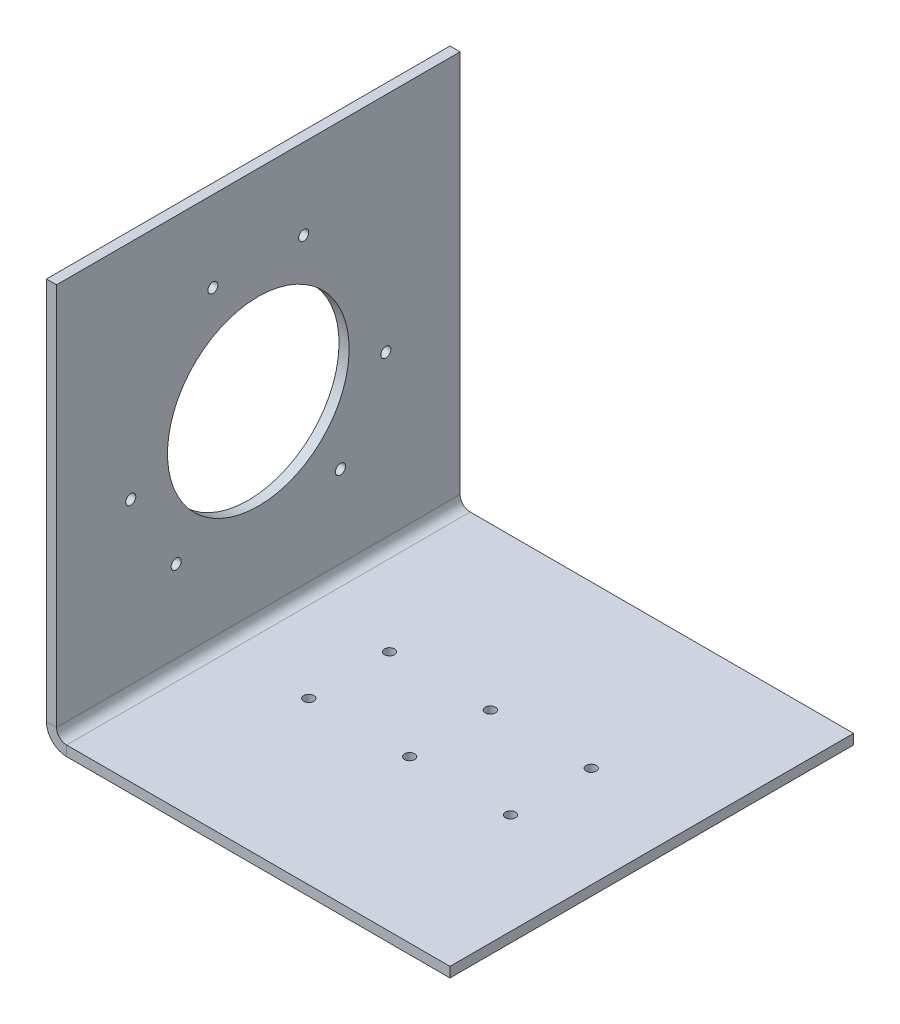
ISO-10303-21;
HEADER;
FILE_DESCRIPTION(('STEP AP214'),'2;1');
FILE_NAME('part.step','',(''),(''),'','','');
FILE_SCHEMA(('AUTOMOTIVE_DESIGN { 1 0 10303 214 1 1 1 1 }'));
ENDSEC;
DATA;
#1=APPLICATION_CONTEXT('core data for automotive mechanical design processes');
#2=APPLICATION_PROTOCOL_DEFINITION('international standard','automotive_design',2000,#1);
#3=PRODUCT_CONTEXT('',#1,'mechanical');
#4=PRODUCT('Part','Part','',(#3));
#5=PRODUCT_RELATED_PRODUCT_CATEGORY('part','',(#4));
#6=PRODUCT_DEFINITION_FORMATION('','',#4);
#7=PRODUCT_DEFINITION_CONTEXT('part definition',#1,'design');
#8=PRODUCT_DEFINITION('design','',#6,#7);
#9=PRODUCT_DEFINITION_SHAPE('','',#8);
#10=(LENGTH_UNIT() NAMED_UNIT(*) SI_UNIT(.MILLI.,.METRE.));
#11=(NAMED_UNIT(*) PLANE_ANGLE_UNIT() SI_UNIT($,.RADIAN.));
#12=(NAMED_UNIT(*) SI_UNIT($,.STERADIAN.) SOLID_ANGLE_UNIT());
#13=UNCERTAINTY_MEASURE_WITH_UNIT(LENGTH_MEASURE(1.E-05),#10,'distance_accuracy_value','');
#14=(GEOMETRIC_REPRESENTATION_CONTEXT(3) GLOBAL_UNCERTAINTY_ASSIGNED_CONTEXT((#13)) GLOBAL_UNIT_ASSIGNED_CONTEXT((#10,
#11,#12)) REPRESENTATION_CONTEXT('',''));
#15=CARTESIAN_POINT('',(0.,0.,0.));
#16=DIRECTION('',(0.,0.,1.));
#17=DIRECTION('',(1.,0.,0.));
#18=AXIS2_PLACEMENT_3D('',#15,#16,#17);
#19=CARTESIAN_POINT('',(0.,-6.35,0.));
#20=DIRECTION('',(0.,0.,1.));
#21=DIRECTION('',(1.,0.,0.));
#22=AXIS2_PLACEMENT_3D('',#19,#20,#21);
#23=PLANE('',#22);
#24=DIRECTION('',(1.,0.,0.));
#25=VECTOR('',#24,1.);
#26=CARTESIAN_POINT('',(0.,0.,0.));
#27=LINE('',#26,#25);
#28=CARTESIAN_POINT('',(12.7,0.,0.));
#29=VERTEX_POINT('',#28);
#30=CARTESIAN_POINT('',(254.,0.,0.));
#31=VERTEX_POINT('',#30);
#32=EDGE_CURVE('E108',#29,#31,#27,.T.);
#33=ORIENTED_EDGE('',*,*,#32,.F.);
#34=DIRECTION('',(0.,-1.,0.));
#35=VECTOR('',#34,1.);
#36=CARTESIAN_POINT('',(12.7,0.,0.));
#37=LINE('',#36,#35);
#38=CARTESIAN_POINT('',(12.7,-6.34999999999998,0.));
#39=VERTEX_POINT('',#38);
#40=EDGE_CURVE('E160',#29,#39,#37,.T.);
#41=ORIENTED_EDGE('',*,*,#40,.T.);
#42=DIRECTION('',(1.,0.,0.));
#43=VECTOR('',#42,1.);
#44=CARTESIAN_POINT('',(0.,-6.35,0.));
#45=LINE('',#44,#43);
#46=CARTESIAN_POINT('',(254.,-6.35,0.));
#47=VERTEX_POINT('',#46);
#48=EDGE_CURVE('E113',#39,#47,#45,.T.);
#49=ORIENTED_EDGE('',*,*,#48,.T.);
#50=DIRECTION('',(0.,1.,0.));
#51=VECTOR('',#50,1.);
#52=CARTESIAN_POINT('',(254.,-6.35,0.));
#53=LINE('',#52,#51);
#54=EDGE_CURVE('E66',#47,#31,#53,.T.);
#55=ORIENTED_EDGE('',*,*,#54,.T.);
#56=EDGE_LOOP('',(#33,#41,#49,#55));
#57=FACE_BOUND('',#56,.T.);
#58=ADVANCED_FACE('F58',(#57),#23,.T.);
#59=CARTESIAN_POINT('',(0.,-6.35,0.));
#60=DIRECTION('',(0.,-1.,0.));
#61=DIRECTION('',(0.,0.,-1.));
#62=AXIS2_PLACEMENT_3D('',#59,#60,#61);
#63=PLANE('',#62);
#64=CARTESIAN_POINT('',(190.5,-6.35,-101.6));
#65=DIRECTION('',(0.,1.,0.));
#66=DIRECTION('',(0.,0.,1.));
#67=AXIS2_PLACEMENT_3D('',#64,#65,#66);
#68=CIRCLE('',#67,3.175);
#69=CARTESIAN_POINT('',(190.5,-6.35,-98.425));
#70=VERTEX_POINT('',#69);
#71=EDGE_CURVE('E152',#70,#70,#68,.T.);
#72=ORIENTED_EDGE('',*,*,#71,.T.);
#73=EDGE_LOOP('',(#72));
#74=FACE_BOUND('',#73,.T.);
#75=CARTESIAN_POINT('',(63.5,-6.35,-101.6));
#76=DIRECTION('',(0.,1.,0.));
#77=DIRECTION('',(0.,0.,1.));
#78=AXIS2_PLACEMENT_3D('',#75,#76,#77);
#79=CIRCLE('',#78,3.175);
#80=CARTESIAN_POINT('',(63.5,-6.35,-98.425));
#81=VERTEX_POINT('',#80);
#82=EDGE_CURVE('E146',#81,#81,#79,.T.);
#83=ORIENTED_EDGE('',*,*,#82,.T.);
#84=EDGE_LOOP('',(#83));
#85=FACE_BOUND('',#84,.T.);
#86=CARTESIAN_POINT('',(127.,-6.35,-101.6));
#87=DIRECTION('',(0.,1.,0.));
#88=DIRECTION('',(0.,0.,1.));
#89=AXIS2_PLACEMENT_3D('',#86,#87,#88);
#90=CIRCLE('',#89,3.17499999999997);
#91=CARTESIAN_POINT('',(127.,-6.35,-98.425));
#92=VERTEX_POINT('',#91);
#93=EDGE_CURVE('E140',#92,#92,#90,.T.);
#94=ORIENTED_EDGE('',*,*,#93,.T.);
#95=EDGE_LOOP('',(#94));
#96=FACE_BOUND('',#95,.T.);
#97=CARTESIAN_POINT('',(63.5,-6.35,-152.4));
#98=DIRECTION('',(0.,1.,0.));
#99=DIRECTION('',(0.,0.,1.));
#100=AXIS2_PLACEMENT_3D('',#97,#98,#99);
#101=CIRCLE('',#100,3.175);
#102=CARTESIAN_POINT('',(63.5,-6.35,-149.225));
#103=VERTEX_POINT('',#102);
#104=EDGE_CURVE('E134',#103,#103,#101,.T.);
#105=ORIENTED_EDGE('',*,*,#104,.T.);
#106=EDGE_LOOP('',(#105));
#107=FACE_BOUND('',#106,.T.);
#108=CARTESIAN_POINT('',(127.,-6.35,-152.4));
#109=DIRECTION('',(0.,1.,0.));
#110=DIRECTION('',(0.,0.,1.));
#111=AXIS2_PLACEMENT_3D('',#108,#109,#110);
#112=CIRCLE('',#111,3.17499999999997);
#113=CARTESIAN_POINT('',(127.,-6.35,-149.225));
#114=VERTEX_POINT('',#113);
#115=EDGE_CURVE('E128',#114,#114,#112,.T.);
#116=ORIENTED_EDGE('',*,*,#115,.T.);
#117=EDGE_LOOP('',(#116));
#118=FACE_BOUND('',#117,.T.);
#119=CARTESIAN_POINT('',(190.5,-6.35,-152.4));
#120=DIRECTION('',(0.,1.,0.));
#121=DIRECTION('',(0.,0.,1.));
#122=AXIS2_PLACEMENT_3D('',#119,#120,#121);
#123=CIRCLE('',#122,3.175);
#124=CARTESIAN_POINT('',(190.5,-6.35,-149.225));
#125=VERTEX_POINT('',#124);
#126=EDGE_CURVE('E121',#125,#125,#123,.T.);
#127=ORIENTED_EDGE('',*,*,#126,.T.);
#128=EDGE_LOOP('',(#127));
#129=FACE_BOUND('',#128,.T.);
#130=ORIENTED_EDGE('',*,*,#48,.F.);
#131=DIRECTION('',(0.,0.,1.));
#132=VECTOR('',#131,1.);
#133=CARTESIAN_POINT('',(12.7,-6.34999999999998,0.));
#134=LINE('',#133,#132);
#135=CARTESIAN_POINT('',(12.6999999999999,-6.35,-254.));
#136=VERTEX_POINT('',#135);
#137=EDGE_CURVE('E177',#39,#136,#134,.F.);
#138=ORIENTED_EDGE('',*,*,#137,.T.);
#139=DIRECTION('',(-1.,0.,0.));
#140=VECTOR('',#139,1.);
#141=CARTESIAN_POINT('',(0.,-6.35,-254.));
#142=LINE('',#141,#140);
#143=CARTESIAN_POINT('',(254.,-6.35,-254.));
#144=VERTEX_POINT('',#143);
#145=EDGE_CURVE('E117',#144,#136,#142,.T.);
#146=ORIENTED_EDGE('',*,*,#145,.F.);
#147=DIRECTION('',(0.,0.,-1.));
#148=VECTOR('',#147,1.);
#149=CARTESIAN_POINT('',(254.,-6.35,0.));
#150=LINE('',#149,#148);
#151=EDGE_CURVE('E98',#47,#144,#150,.T.);
#152=ORIENTED_EDGE('',*,*,#151,.F.);
#153=EDGE_LOOP('',(#130,#138,#146,#152));
#154=FACE_BOUND('',#153,.T.);
#155=ADVANCED_FACE('F314',(#74,#85,#96,#107,#118,#129,#154),#63,.T.);
#156=CARTESIAN_POINT('',(0.,0.,0.));
#157=DIRECTION('',(0.,-1.,0.));
#158=DIRECTION('',(0.,0.,-1.));
#159=AXIS2_PLACEMENT_3D('',#156,#157,#158);
#160=PLANE('',#159);
#161=CARTESIAN_POINT('',(190.5,0.,-152.4));
#162=DIRECTION('',(0.,1.,0.));
#163=DIRECTION('',(0.,0.,1.));
#164=AXIS2_PLACEMENT_3D('',#161,#162,#163);
#165=CIRCLE('',#164,3.175);
#166=CARTESIAN_POINT('',(190.5,0.,-149.225));
#167=VERTEX_POINT('',#166);
#168=EDGE_CURVE('E123',#167,#167,#165,.T.);
#169=ORIENTED_EDGE('',*,*,#168,.F.);
#170=EDGE_LOOP('',(#169));
#171=FACE_BOUND('',#170,.T.);
#172=CARTESIAN_POINT('',(127.,0.,-152.4));
#173=DIRECTION('',(0.,1.,0.));
#174=DIRECTION('',(0.,0.,1.));
#175=AXIS2_PLACEMENT_3D('',#172,#173,#174);
#176=CIRCLE('',#175,3.17499999999997);
#177=CARTESIAN_POINT('',(127.,0.,-149.225));
#178=VERTEX_POINT('',#177);
#179=EDGE_CURVE('E131',#178,#178,#176,.T.);
#180=ORIENTED_EDGE('',*,*,#179,.F.);
#181=EDGE_LOOP('',(#180));
#182=FACE_BOUND('',#181,.T.);
#183=CARTESIAN_POINT('',(63.5,0.,-152.4));
#184=DIRECTION('',(0.,1.,0.));
#185=DIRECTION('',(0.,0.,1.));
#186=AXIS2_PLACEMENT_3D('',#183,#184,#185);
#187=CIRCLE('',#186,3.175);
#188=CARTESIAN_POINT('',(63.5,0.,-149.225));
#189=VERTEX_POINT('',#188);
#190=EDGE_CURVE('E137',#189,#189,#187,.T.);
#191=ORIENTED_EDGE('',*,*,#190,.F.);
#192=EDGE_LOOP('',(#191));
#193=FACE_BOUND('',#192,.T.);
#194=CARTESIAN_POINT('',(127.,0.,-101.6));
#195=DIRECTION('',(0.,1.,0.));
#196=DIRECTION('',(0.,0.,1.));
#197=AXIS2_PLACEMENT_3D('',#194,#195,#196);
#198=CIRCLE('',#197,3.17499999999997);
#199=CARTESIAN_POINT('',(127.,0.,-98.425));
#200=VERTEX_POINT('',#199);
#201=EDGE_CURVE('E143',#200,#200,#198,.T.);
#202=ORIENTED_EDGE('',*,*,#201,.F.);
#203=EDGE_LOOP('',(#202));
#204=FACE_BOUND('',#203,.T.);
#205=CARTESIAN_POINT('',(63.5,0.,-101.6));
#206=DIRECTION('',(0.,1.,0.));
#207=DIRECTION('',(0.,0.,1.));
#208=AXIS2_PLACEMENT_3D('',#205,#206,#207);
#209=CIRCLE('',#208,3.175);
#210=CARTESIAN_POINT('',(63.5,0.,-98.425));
#211=VERTEX_POINT('',#210);
#212=EDGE_CURVE('E149',#211,#211,#209,.T.);
#213=ORIENTED_EDGE('',*,*,#212,.F.);
#214=EDGE_LOOP('',(#213));
#215=FACE_BOUND('',#214,.T.);
#216=CARTESIAN_POINT('',(190.5,0.,-101.6));
#217=DIRECTION('',(0.,1.,0.));
#218=DIRECTION('',(0.,0.,1.));
#219=AXIS2_PLACEMENT_3D('',#216,#217,#218);
#220=CIRCLE('',#219,3.175);
#221=CARTESIAN_POINT('',(190.5,0.,-98.425));
#222=VERTEX_POINT('',#221);
#223=EDGE_CURVE('E155',#222,#222,#220,.T.);
#224=ORIENTED_EDGE('',*,*,#223,.F.);
#225=EDGE_LOOP('',(#224));
#226=FACE_BOUND('',#225,.T.);
#227=DIRECTION('',(0.,0.,1.));
#228=VECTOR('',#227,1.);
#229=CARTESIAN_POINT('',(12.7,0.,0.));
#230=LINE('',#229,#228);
#231=CARTESIAN_POINT('',(12.6999999999999,0.,-254.));
#232=VERTEX_POINT('',#231);
#233=EDGE_CURVE('E167',#29,#232,#230,.F.);
#234=ORIENTED_EDGE('',*,*,#233,.F.);
#235=ORIENTED_EDGE('',*,*,#32,.T.);
#236=DIRECTION('',(0.,0.,-1.));
#237=VECTOR('',#236,1.);
#238=CARTESIAN_POINT('',(254.,0.,0.));
#239=LINE('',#238,#237);
#240=CARTESIAN_POINT('',(254.,0.,-254.));
#241=VERTEX_POINT('',#240);
#242=EDGE_CURVE('E96',#31,#241,#239,.T.);
#243=ORIENTED_EDGE('',*,*,#242,.T.);
#244=DIRECTION('',(-1.,0.,0.));
#245=VECTOR('',#244,1.);
#246=CARTESIAN_POINT('',(0.,0.,-254.));
#247=LINE('',#246,#245);
#248=EDGE_CURVE('E105',#241,#232,#247,.T.);
#249=ORIENTED_EDGE('',*,*,#248,.T.);
#250=EDGE_LOOP('',(#234,#235,#243,#249));
#251=FACE_BOUND('',#250,.T.);
#252=ADVANCED_FACE('F103',(#171,#182,#193,#204,#215,#226,#251),#160,.F.);
#253=CARTESIAN_POINT('',(0.,-6.35,-254.));
#254=DIRECTION('',(0.,0.,-1.));
#255=DIRECTION('',(-1.,0.,0.));
#256=AXIS2_PLACEMENT_3D('',#253,#254,#255);
#257=PLANE('',#256);
#258=DIRECTION('',(0.,-1.,0.));
#259=VECTOR('',#258,1.);
#260=CARTESIAN_POINT('',(12.6999999999999,0.,-254.));
#261=LINE('',#260,#259);
#262=EDGE_CURVE('E112',#232,#136,#261,.T.);
#263=ORIENTED_EDGE('',*,*,#262,.F.);
#264=ORIENTED_EDGE('',*,*,#248,.F.);
#265=DIRECTION('',(0.,1.,0.));
#266=VECTOR('',#265,1.);
#267=CARTESIAN_POINT('',(254.,-6.35,-254.));
#268=LINE('',#267,#266);
#269=EDGE_CURVE('E13',#144,#241,#268,.T.);
#270=ORIENTED_EDGE('',*,*,#269,.F.);
#271=ORIENTED_EDGE('',*,*,#145,.T.);
#272=EDGE_LOOP('',(#263,#264,#270,#271));
#273=FACE_BOUND('',#272,.T.);
#274=ADVANCED_FACE('F111',(#273),#257,.T.);
#275=CARTESIAN_POINT('',(254.,-6.35,0.));
#276=DIRECTION('',(1.,0.,0.));
#277=DIRECTION('',(0.,0.,-1.));
#278=AXIS2_PLACEMENT_3D('',#275,#276,#277);
#279=PLANE('',#278);
#280=ORIENTED_EDGE('',*,*,#242,.F.);
#281=ORIENTED_EDGE('',*,*,#54,.F.);
#282=ORIENTED_EDGE('',*,*,#151,.T.);
#283=ORIENTED_EDGE('',*,*,#269,.T.);
#284=EDGE_LOOP('',(#280,#281,#282,#283));
#285=FACE_BOUND('',#284,.T.);
#286=ADVANCED_FACE('F94',(#285),#279,.T.);
#287=CARTESIAN_POINT('',(190.5,-6.35,-152.4));
#288=DIRECTION('',(0.,1.,0.));
#289=DIRECTION('',(0.,0.,1.));
#290=AXIS2_PLACEMENT_3D('',#287,#288,#289);
#291=CYLINDRICAL_SURFACE('',#290,3.175);
#292=ORIENTED_EDGE('',*,*,#126,.F.);
#293=EDGE_LOOP('',(#292));
#294=FACE_BOUND('',#293,.T.);
#295=ORIENTED_EDGE('',*,*,#168,.T.);
#296=EDGE_LOOP('',(#295));
#297=FACE_BOUND('',#296,.T.);
#298=ADVANCED_FACE('F327',(#294,#297),#291,.F.);
#299=CARTESIAN_POINT('',(127.,-6.35,-152.4));
#300=DIRECTION('',(0.,1.,0.));
#301=DIRECTION('',(0.,0.,1.));
#302=AXIS2_PLACEMENT_3D('',#299,#300,#301);
#303=CYLINDRICAL_SURFACE('',#302,3.17499999999997);
#304=ORIENTED_EDGE('',*,*,#115,.F.);
#305=EDGE_LOOP('',(#304));
#306=FACE_BOUND('',#305,.T.);
#307=ORIENTED_EDGE('',*,*,#179,.T.);
#308=EDGE_LOOP('',(#307));
#309=FACE_BOUND('',#308,.T.);
#310=ADVANCED_FACE('F335',(#306,#309),#303,.F.);
#311=CARTESIAN_POINT('',(63.5,-6.35,-152.4));
#312=DIRECTION('',(0.,1.,0.));
#313=DIRECTION('',(0.,0.,1.));
#314=AXIS2_PLACEMENT_3D('',#311,#312,#313);
#315=CYLINDRICAL_SURFACE('',#314,3.175);
#316=ORIENTED_EDGE('',*,*,#104,.F.);
#317=EDGE_LOOP('',(#316));
#318=FACE_BOUND('',#317,.T.);
#319=ORIENTED_EDGE('',*,*,#190,.T.);
#320=EDGE_LOOP('',(#319));
#321=FACE_BOUND('',#320,.T.);
#322=ADVANCED_FACE('F340',(#318,#321),#315,.F.);
#323=CARTESIAN_POINT('',(127.,-6.35,-101.6));
#324=DIRECTION('',(0.,1.,0.));
#325=DIRECTION('',(0.,0.,1.));
#326=AXIS2_PLACEMENT_3D('',#323,#324,#325);
#327=CYLINDRICAL_SURFACE('',#326,3.17499999999997);
#328=ORIENTED_EDGE('',*,*,#93,.F.);
#329=EDGE_LOOP('',(#328));
#330=FACE_BOUND('',#329,.T.);
#331=ORIENTED_EDGE('',*,*,#201,.T.);
#332=EDGE_LOOP('',(#331));
#333=FACE_BOUND('',#332,.T.);
#334=ADVANCED_FACE('F367',(#330,#333),#327,.F.);
#335=CARTESIAN_POINT('',(63.5,-6.35,-101.6));
#336=DIRECTION('',(0.,1.,0.));
#337=DIRECTION('',(0.,0.,1.));
#338=AXIS2_PLACEMENT_3D('',#335,#336,#337);
#339=CYLINDRICAL_SURFACE('',#338,3.175);
#340=ORIENTED_EDGE('',*,*,#82,.F.);
#341=EDGE_LOOP('',(#340));
#342=FACE_BOUND('',#341,.T.);
#343=ORIENTED_EDGE('',*,*,#212,.T.);
#344=EDGE_LOOP('',(#343));
#345=FACE_BOUND('',#344,.T.);
#346=ADVANCED_FACE('F358',(#342,#345),#339,.F.);
#347=CARTESIAN_POINT('',(190.5,-6.35,-101.6));
#348=DIRECTION('',(0.,1.,0.));
#349=DIRECTION('',(0.,0.,1.));
#350=AXIS2_PLACEMENT_3D('',#347,#348,#349);
#351=CYLINDRICAL_SURFACE('',#350,3.175);
#352=ORIENTED_EDGE('',*,*,#71,.F.);
#353=EDGE_LOOP('',(#352));
#354=FACE_BOUND('',#353,.T.);
#355=ORIENTED_EDGE('',*,*,#223,.T.);
#356=EDGE_LOOP('',(#355));
#357=FACE_BOUND('',#356,.T.);
#358=ADVANCED_FACE('F355',(#354,#357),#351,.F.);
#359=CARTESIAN_POINT('',(12.7,6.35,-254.));
#360=DIRECTION('',(0.,0.,-1.));
#361=DIRECTION('',(-1.,0.,0.));
#362=AXIS2_PLACEMENT_3D('',#359,#360,#361);
#363=PLANE('',#362);
#364=DIRECTION('',(1.,0.,0.));
#365=VECTOR('',#364,1.);
#366=CARTESIAN_POINT('',(0.,6.34999999999995,-254.));
#367=LINE('',#366,#365);
#368=CARTESIAN_POINT('',(6.34999999999998,6.34999999999998,-254.));
#369=VERTEX_POINT('',#368);
#370=CARTESIAN_POINT('',(0.,6.34999999999995,-254.));
#371=VERTEX_POINT('',#370);
#372=EDGE_CURVE('E181',#369,#371,#367,.F.);
#373=ORIENTED_EDGE('',*,*,#372,.F.);
#374=CARTESIAN_POINT('',(12.7,6.35,-254.));
#375=DIRECTION('',(0.,0.,1.));
#376=DIRECTION('',(1.,0.,0.));
#377=AXIS2_PLACEMENT_3D('',#374,#375,#376);
#378=CIRCLE('',#377,6.34999999999998);
#379=EDGE_CURVE('E171',#232,#369,#378,.F.);
#380=ORIENTED_EDGE('',*,*,#379,.F.);
#381=ORIENTED_EDGE('',*,*,#262,.T.);
#382=CARTESIAN_POINT('',(12.7,6.35,-254.));
#383=DIRECTION('',(0.,0.,1.));
#384=DIRECTION('',(1.,0.,0.));
#385=AXIS2_PLACEMENT_3D('',#382,#383,#384);
#386=CIRCLE('',#385,12.7);
#387=EDGE_CURVE('E74',#136,#371,#386,.F.);
#388=ORIENTED_EDGE('',*,*,#387,.T.);
#389=EDGE_LOOP('',(#373,#380,#381,#388));
#390=FACE_BOUND('',#389,.T.);
#391=ADVANCED_FACE('F357',(#390),#363,.T.);
#392=CARTESIAN_POINT('',(12.7,6.35,0.));
#393=DIRECTION('',(0.,0.,-1.));
#394=DIRECTION('',(-1.,0.,0.));
#395=AXIS2_PLACEMENT_3D('',#392,#393,#394);
#396=PLANE('',#395);
#397=CARTESIAN_POINT('',(12.7,6.35,0.));
#398=DIRECTION('',(0.,0.,1.));
#399=DIRECTION('',(1.,0.,0.));
#400=AXIS2_PLACEMENT_3D('',#397,#398,#399);
#401=CIRCLE('',#400,6.34999999999998);
#402=CARTESIAN_POINT('',(6.35000000000001,6.34999999999998,0.));
#403=VERTEX_POINT('',#402);
#404=EDGE_CURVE('E164',#403,#29,#401,.T.);
#405=ORIENTED_EDGE('',*,*,#404,.F.);
#406=DIRECTION('',(1.,0.,0.));
#407=VECTOR('',#406,1.);
#408=CARTESIAN_POINT('',(6.34999999999998,6.34999999999998,0.));
#409=LINE('',#408,#407);
#410=CARTESIAN_POINT('',(0.,6.34999999999995,0.));
#411=VERTEX_POINT('',#410);
#412=EDGE_CURVE('E187',#403,#411,#409,.F.);
#413=ORIENTED_EDGE('',*,*,#412,.T.);
#414=CARTESIAN_POINT('',(12.7,6.35,0.));
#415=DIRECTION('',(0.,0.,1.));
#416=DIRECTION('',(1.,0.,0.));
#417=AXIS2_PLACEMENT_3D('',#414,#415,#416);
#418=CIRCLE('',#417,12.7);
#419=EDGE_CURVE('E174',#411,#39,#418,.T.);
#420=ORIENTED_EDGE('',*,*,#419,.T.);
#421=ORIENTED_EDGE('',*,*,#40,.F.);
#422=EDGE_LOOP('',(#405,#413,#420,#421));
#423=FACE_BOUND('',#422,.T.);
#424=ADVANCED_FACE('F308',(#423),#396,.F.);
#425=CARTESIAN_POINT('',(12.7,6.35,0.));
#426=DIRECTION('',(0.,0.,1.));
#427=DIRECTION('',(-1.,0.,0.));
#428=AXIS2_PLACEMENT_3D('',#425,#426,#427);
#429=CYLINDRICAL_SURFACE('',#428,12.7);
#430=ORIENTED_EDGE('',*,*,#137,.F.);
#431=ORIENTED_EDGE('',*,*,#419,.F.);
#432=DIRECTION('',(0.,0.,1.));
#433=VECTOR('',#432,1.);
#434=CARTESIAN_POINT('',(0.,6.34999999999995,-254.));
#435=LINE('',#434,#433);
#436=EDGE_CURVE('E190',#411,#371,#435,.F.);
#437=ORIENTED_EDGE('',*,*,#436,.T.);
#438=ORIENTED_EDGE('',*,*,#387,.F.);
#439=EDGE_LOOP('',(#430,#431,#437,#438));
#440=FACE_BOUND('',#439,.T.);
#441=ADVANCED_FACE('F386',(#440),#429,.T.);
#442=CARTESIAN_POINT('',(12.7,6.35,0.));
#443=DIRECTION('',(0.,0.,1.));
#444=DIRECTION('',(-1.,0.,0.));
#445=AXIS2_PLACEMENT_3D('',#442,#443,#444);
#446=CYLINDRICAL_SURFACE('',#445,6.34999999999998);
#447=ORIENTED_EDGE('',*,*,#233,.T.);
#448=ORIENTED_EDGE('',*,*,#379,.T.);
#449=DIRECTION('',(0.,0.,1.));
#450=VECTOR('',#449,1.);
#451=CARTESIAN_POINT('',(6.34999999999998,6.34999999999998,-254.));
#452=LINE('',#451,#450);
#453=EDGE_CURVE('E184',#369,#403,#452,.T.);
#454=ORIENTED_EDGE('',*,*,#453,.T.);
#455=ORIENTED_EDGE('',*,*,#404,.T.);
#456=EDGE_LOOP('',(#447,#448,#454,#455));
#457=FACE_BOUND('',#456,.T.);
#458=ADVANCED_FACE('F311',(#457),#446,.F.);
#459=CARTESIAN_POINT('',(0.,0.,-254.));
#460=DIRECTION('',(0.,0.,1.));
#461=DIRECTION('',(1.,0.,0.));
#462=AXIS2_PLACEMENT_3D('',#459,#460,#461);
#463=PLANE('',#462);
#464=ORIENTED_EDGE('',*,*,#372,.T.);
#465=DIRECTION('',(0.,-1.,0.));
#466=VECTOR('',#465,1.);
#467=CARTESIAN_POINT('',(0.,0.,-254.));
#468=LINE('',#467,#466);
#469=CARTESIAN_POINT('',(-8.64665353564502E-13,247.65,-254.));
#470=VERTEX_POINT('',#469);
#471=EDGE_CURVE('E201',#470,#371,#468,.T.);
#472=ORIENTED_EDGE('',*,*,#471,.F.);
#473=DIRECTION('',(1.,0.,0.));
#474=VECTOR('',#473,1.);
#475=CARTESIAN_POINT('',(-8.64665353564502E-13,247.65,-254.));
#476=LINE('',#475,#474);
#477=CARTESIAN_POINT('',(6.34999999999913,247.65,-254.));
#478=VERTEX_POINT('',#477);
#479=EDGE_CURVE('E210',#470,#478,#476,.T.);
#480=ORIENTED_EDGE('',*,*,#479,.T.);
#481=DIRECTION('',(0.,1.,0.));
#482=VECTOR('',#481,1.);
#483=CARTESIAN_POINT('',(6.35,0.,-254.));
#484=LINE('',#483,#482);
#485=EDGE_CURVE('E192',#478,#369,#484,.F.);
#486=ORIENTED_EDGE('',*,*,#485,.T.);
#487=EDGE_LOOP('',(#464,#472,#480,#486));
#488=FACE_BOUND('',#487,.T.);
#489=ADVANCED_FACE('F388',(#488),#463,.F.);
#490=CARTESIAN_POINT('',(-8.64759652774438E-13,247.65,0.));
#491=DIRECTION('',(0.,0.,-1.));
#492=DIRECTION('',(-1.,0.,0.));
#493=AXIS2_PLACEMENT_3D('',#490,#491,#492);
#494=PLANE('',#493);
#495=ORIENTED_EDGE('',*,*,#412,.F.);
#496=DIRECTION('',(0.,-1.,0.));
#497=VECTOR('',#496,1.);
#498=CARTESIAN_POINT('',(6.34999999999913,247.65,0.));
#499=LINE('',#498,#497);
#500=CARTESIAN_POINT('',(6.34999999999913,247.65,0.));
#501=VERTEX_POINT('',#500);
#502=EDGE_CURVE('E195',#403,#501,#499,.F.);
#503=ORIENTED_EDGE('',*,*,#502,.T.);
#504=DIRECTION('',(1.,0.,0.));
#505=VECTOR('',#504,1.);
#506=CARTESIAN_POINT('',(-8.64759652774438E-13,247.65,0.));
#507=LINE('',#506,#505);
#508=CARTESIAN_POINT('',(-8.64665353564502E-13,247.65,0.));
#509=VERTEX_POINT('',#508);
#510=EDGE_CURVE('E168',#509,#501,#507,.T.);
#511=ORIENTED_EDGE('',*,*,#510,.F.);
#512=DIRECTION('',(0.,1.,0.));
#513=VECTOR('',#512,1.);
#514=CARTESIAN_POINT('',(0.,0.,0.));
#515=LINE('',#514,#513);
#516=EDGE_CURVE('E204',#411,#509,#515,.T.);
#517=ORIENTED_EDGE('',*,*,#516,.F.);
#518=EDGE_LOOP('',(#495,#503,#511,#517));
#519=FACE_BOUND('',#518,.T.);
#520=ADVANCED_FACE('F280',(#519),#494,.F.);
#521=CARTESIAN_POINT('',(0.,0.,0.));
#522=DIRECTION('',(1.,0.,0.));
#523=DIRECTION('',(0.,1.,0.));
#524=AXIS2_PLACEMENT_3D('',#521,#522,#523);
#525=PLANE('',#524);
#526=CARTESIAN_POINT('',(-1.26114396703514E-12,107.29667591314,-207.278635768374));
#527=DIRECTION('',(1.,0.,0.));
#528=DIRECTION('',(0.,1.,0.));
#529=AXIS2_PLACEMENT_3D('',#526,#527,#528);
#530=CIRCLE('',#529,3.175);
#531=CARTESIAN_POINT('',(-1.27222942028597E-12,110.47167591314,-207.278635768374));
#532=VERTEX_POINT('',#531);
#533=EDGE_CURVE('E225',#532,#532,#530,.T.);
#534=ORIENTED_EDGE('',*,*,#533,.T.);
#535=EDGE_LOOP('',(#534));
#536=FACE_BOUND('',#535,.T.);
#537=CARTESIAN_POINT('',(-1.08853898117545E-12,57.8033240868597,-178.703635768374));
#538=DIRECTION('',(1.,0.,0.));
#539=DIRECTION('',(0.,1.,0.));
#540=AXIS2_PLACEMENT_3D('',#537,#538,#539);
#541=CIRCLE('',#540,3.175);
#542=CARTESIAN_POINT('',(-1.09962938261001E-12,60.9783240868597,-178.703635768374));
#543=VERTEX_POINT('',#542);
#544=EDGE_CURVE('E231',#543,#543,#541,.T.);
#545=ORIENTED_EDGE('',*,*,#544,.T.);
#546=EDGE_LOOP('',(#545));
#547=FACE_BOUND('',#546,.T.);
#548=CARTESIAN_POINT('',(-1.57426155444895E-12,196.85,-155.575));
#549=DIRECTION('',(1.,0.,0.));
#550=DIRECTION('',(0.,1.,0.));
#551=AXIS2_PLACEMENT_3D('',#548,#549,#550);
#552=CIRCLE('',#551,3.17499999999997);
#553=CARTESIAN_POINT('',(-1.58535195588352E-12,200.025,-155.575));
#554=VERTEX_POINT('',#553);
#555=EDGE_CURVE('E237',#554,#554,#552,.T.);
#556=ORIENTED_EDGE('',*,*,#555,.T.);
#557=EDGE_LOOP('',(#556));
#558=FACE_BOUND('',#557,.T.);
#559=CARTESIAN_POINT('',(-1.57426155444895E-12,196.85,-98.425));
#560=DIRECTION('',(1.,0.,0.));
#561=DIRECTION('',(0.,1.,0.));
#562=AXIS2_PLACEMENT_3D('',#559,#560,#561);
#563=CIRCLE('',#562,3.175);
#564=CARTESIAN_POINT('',(-1.58535195588352E-12,200.025,-98.425));
#565=VERTEX_POINT('',#564);
#566=EDGE_CURVE('E243',#565,#565,#563,.T.);
#567=ORIENTED_EDGE('',*,*,#566,.T.);
#568=EDGE_LOOP('',(#567));
#569=FACE_BOUND('',#568,.T.);
#570=CARTESIAN_POINT('',(-1.26114396703514E-12,107.29667591314,-46.7213642316258));
#571=DIRECTION('',(1.,0.,0.));
#572=DIRECTION('',(0.,1.,0.));
#573=AXIS2_PLACEMENT_3D('',#570,#571,#572);
#574=CIRCLE('',#573,3.175);
#575=CARTESIAN_POINT('',(-1.2722343684697E-12,110.47167591314,-46.7213642316258));
#576=VERTEX_POINT('',#575);
#577=EDGE_CURVE('E249',#576,#576,#574,.T.);
#578=ORIENTED_EDGE('',*,*,#577,.T.);
#579=EDGE_LOOP('',(#578));
#580=FACE_BOUND('',#579,.T.);
#581=CARTESIAN_POINT('',(-1.08853898117545E-12,57.8033240868597,-75.2963642316258));
#582=DIRECTION('',(1.,0.,0.));
#583=DIRECTION('',(0.,1.,0.));
#584=AXIS2_PLACEMENT_3D('',#581,#582,#583);
#585=CIRCLE('',#584,3.175);
#586=CARTESIAN_POINT('',(-1.09962938261001E-12,60.9783240868597,-75.2963642316258));
#587=VERTEX_POINT('',#586);
#588=EDGE_CURVE('E218',#587,#587,#585,.T.);
#589=ORIENTED_EDGE('',*,*,#588,.T.);
#590=EDGE_LOOP('',(#589));
#591=FACE_BOUND('',#590,.T.);
#592=CARTESIAN_POINT('',(-4.21247223531424E-13,120.65,-127.));
#593=DIRECTION('',(-1.,0.,0.));
#594=DIRECTION('',(0.,-1.,0.));
#595=AXIS2_PLACEMENT_3D('',#592,#593,#594);
#596=CIRCLE('',#595,57.15);
#597=CARTESIAN_POINT('',(-2.21709065016539E-13,63.5,-127.));
#598=VERTEX_POINT('',#597);
#599=EDGE_CURVE('E215',#598,#598,#596,.T.);
#600=ORIENTED_EDGE('',*,*,#599,.F.);
#601=EDGE_LOOP('',(#600));
#602=FACE_BOUND('',#601,.T.);
#603=ORIENTED_EDGE('',*,*,#436,.F.);
#604=ORIENTED_EDGE('',*,*,#516,.T.);
#605=DIRECTION('',(0.,0.,-1.));
#606=VECTOR('',#605,1.);
#607=CARTESIAN_POINT('',(-8.64665353564502E-13,247.65,0.));
#608=LINE('',#607,#606);
#609=EDGE_CURVE('E207',#509,#470,#608,.T.);
#610=ORIENTED_EDGE('',*,*,#609,.T.);
#611=ORIENTED_EDGE('',*,*,#471,.T.);
#612=EDGE_LOOP('',(#603,#604,#610,#611));
#613=FACE_BOUND('',#612,.T.);
#614=ADVANCED_FACE('F261',(#536,#547,#558,#569,#580,#591,#602,#613),#525,.F.);
#615=CARTESIAN_POINT('',(6.35,0.,0.));
#616=DIRECTION('',(1.,0.,0.));
#617=DIRECTION('',(0.,1.,0.));
#618=AXIS2_PLACEMENT_3D('',#615,#616,#617);
#619=PLANE('',#618);
#620=CARTESIAN_POINT('',(6.34999999999962,107.29667591314,-207.278635768374));
#621=DIRECTION('',(1.,0.,0.));
#622=DIRECTION('',(0.,1.,0.));
#623=AXIS2_PLACEMENT_3D('',#620,#621,#622);
#624=CIRCLE('',#623,3.175);
#625=CARTESIAN_POINT('',(6.34999999999961,110.47167591314,-207.278635768374));
#626=VERTEX_POINT('',#625);
#627=EDGE_CURVE('E228',#626,#626,#624,.T.);
#628=ORIENTED_EDGE('',*,*,#627,.F.);
#629=EDGE_LOOP('',(#628));
#630=FACE_BOUND('',#629,.T.);
#631=CARTESIAN_POINT('',(6.3499999999998,57.8033240868597,-178.703635768374));
#632=DIRECTION('',(1.,0.,0.));
#633=DIRECTION('',(0.,1.,0.));
#634=AXIS2_PLACEMENT_3D('',#631,#632,#633);
#635=CIRCLE('',#634,3.175);
#636=CARTESIAN_POINT('',(6.34999999999979,60.9783240868597,-178.703635768374));
#637=VERTEX_POINT('',#636);
#638=EDGE_CURVE('E234',#637,#637,#635,.T.);
#639=ORIENTED_EDGE('',*,*,#638,.F.);
#640=EDGE_LOOP('',(#639));
#641=FACE_BOUND('',#640,.T.);
#642=CARTESIAN_POINT('',(6.34999999999931,196.85,-155.575));
#643=DIRECTION('',(1.,0.,0.));
#644=DIRECTION('',(0.,1.,0.));
#645=AXIS2_PLACEMENT_3D('',#642,#643,#644);
#646=CIRCLE('',#645,3.17499999999997);
#647=CARTESIAN_POINT('',(6.3499999999993,200.025,-155.575));
#648=VERTEX_POINT('',#647);
#649=EDGE_CURVE('E240',#648,#648,#646,.T.);
#650=ORIENTED_EDGE('',*,*,#649,.F.);
#651=EDGE_LOOP('',(#650));
#652=FACE_BOUND('',#651,.T.);
#653=CARTESIAN_POINT('',(6.34999999999931,196.85,-98.425));
#654=DIRECTION('',(1.,0.,0.));
#655=DIRECTION('',(0.,1.,0.));
#656=AXIS2_PLACEMENT_3D('',#653,#654,#655);
#657=CIRCLE('',#656,3.175);
#658=CARTESIAN_POINT('',(6.3499999999993,200.025,-98.425));
#659=VERTEX_POINT('',#658);
#660=EDGE_CURVE('E246',#659,#659,#657,.T.);
#661=ORIENTED_EDGE('',*,*,#660,.F.);
#662=EDGE_LOOP('',(#661));
#663=FACE_BOUND('',#662,.T.);
#664=CARTESIAN_POINT('',(6.34999999999962,107.29667591314,-46.7213642316258));
#665=DIRECTION('',(1.,0.,0.));
#666=DIRECTION('',(0.,1.,0.));
#667=AXIS2_PLACEMENT_3D('',#664,#665,#666);
#668=CIRCLE('',#667,3.175);
#669=CARTESIAN_POINT('',(6.34999999999961,110.47167591314,-46.7213642316258));
#670=VERTEX_POINT('',#669);
#671=EDGE_CURVE('E222',#670,#670,#668,.T.);
#672=ORIENTED_EDGE('',*,*,#671,.F.);
#673=EDGE_LOOP('',(#672));
#674=FACE_BOUND('',#673,.T.);
#675=CARTESIAN_POINT('',(6.3499999999998,57.8033240868597,-75.2963642316258));
#676=DIRECTION('',(1.,0.,0.));
#677=DIRECTION('',(0.,1.,0.));
#678=AXIS2_PLACEMENT_3D('',#675,#676,#677);
#679=CIRCLE('',#678,3.175);
#680=CARTESIAN_POINT('',(6.34999999999979,60.9783240868597,-75.2963642316258));
#681=VERTEX_POINT('',#680);
#682=EDGE_CURVE('E219',#681,#681,#679,.T.);
#683=ORIENTED_EDGE('',*,*,#682,.F.);
#684=EDGE_LOOP('',(#683));
#685=FACE_BOUND('',#684,.T.);
#686=CARTESIAN_POINT('',(6.34999999999958,120.65,-127.));
#687=DIRECTION('',(1.,0.,0.));
#688=DIRECTION('',(0.,1.,0.));
#689=AXIS2_PLACEMENT_3D('',#686,#687,#688);
#690=CIRCLE('',#689,57.15);
#691=CARTESIAN_POINT('',(6.34999999999938,177.8,-127.));
#692=VERTEX_POINT('',#691);
#693=EDGE_CURVE('E61',#692,#692,#690,.T.);
#694=ORIENTED_EDGE('',*,*,#693,.F.);
#695=EDGE_LOOP('',(#694));
#696=FACE_BOUND('',#695,.T.);
#697=ORIENTED_EDGE('',*,*,#502,.F.);
#698=ORIENTED_EDGE('',*,*,#453,.F.);
#699=ORIENTED_EDGE('',*,*,#485,.F.);
#700=DIRECTION('',(0.,0.,1.));
#701=VECTOR('',#700,1.);
#702=CARTESIAN_POINT('',(6.34999999999913,247.65,-254.));
#703=LINE('',#702,#701);
#704=EDGE_CURVE('E198',#501,#478,#703,.F.);
#705=ORIENTED_EDGE('',*,*,#704,.F.);
#706=EDGE_LOOP('',(#697,#698,#699,#705));
#707=FACE_BOUND('',#706,.T.);
#708=ADVANCED_FACE('F257',(#630,#641,#652,#663,#674,#685,#696,#707),#619,.T.);
#709=CARTESIAN_POINT('',(-8.64759652774438E-13,247.65,-254.));
#710=DIRECTION('',(0.,-1.,0.));
#711=DIRECTION('',(1.,0.,0.));
#712=AXIS2_PLACEMENT_3D('',#709,#710,#711);
#713=PLANE('',#712);
#714=ORIENTED_EDGE('',*,*,#704,.T.);
#715=ORIENTED_EDGE('',*,*,#479,.F.);
#716=ORIENTED_EDGE('',*,*,#609,.F.);
#717=ORIENTED_EDGE('',*,*,#510,.T.);
#718=EDGE_LOOP('',(#714,#715,#716,#717));
#719=FACE_BOUND('',#718,.T.);
#720=ADVANCED_FACE('F260',(#719),#713,.F.);
#721=CARTESIAN_POINT('',(254.,120.650000000001,-127.));
#722=DIRECTION('',(-1.,0.,0.));
#723=DIRECTION('',(0.,-1.,0.));
#724=AXIS2_PLACEMENT_3D('',#721,#722,#723);
#725=CYLINDRICAL_SURFACE('',#724,57.15);
#726=ORIENTED_EDGE('',*,*,#693,.T.);
#727=EDGE_LOOP('',(#726));
#728=FACE_BOUND('',#727,.T.);
#729=ORIENTED_EDGE('',*,*,#599,.T.);
#730=EDGE_LOOP('',(#729));
#731=FACE_BOUND('',#730,.T.);
#732=ADVANCED_FACE('F537',(#728,#731),#725,.F.);
#733=CARTESIAN_POINT('',(-1.08853898117545E-12,57.8033240868597,-75.2963642316258));
#734=DIRECTION('',(1.,0.,0.));
#735=DIRECTION('',(0.,1.,0.));
#736=AXIS2_PLACEMENT_3D('',#733,#734,#735);
#737=CYLINDRICAL_SURFACE('',#736,3.175);
#738=ORIENTED_EDGE('',*,*,#588,.F.);
#739=EDGE_LOOP('',(#738));
#740=FACE_BOUND('',#739,.T.);
#741=ORIENTED_EDGE('',*,*,#682,.T.);
#742=EDGE_LOOP('',(#741));
#743=FACE_BOUND('',#742,.T.);
#744=ADVANCED_FACE('F545',(#740,#743),#737,.F.);
#745=CARTESIAN_POINT('',(-1.26114396703514E-12,107.29667591314,-46.7213642316258));
#746=DIRECTION('',(1.,0.,0.));
#747=DIRECTION('',(0.,1.,0.));
#748=AXIS2_PLACEMENT_3D('',#745,#746,#747);
#749=CYLINDRICAL_SURFACE('',#748,3.175);
#750=ORIENTED_EDGE('',*,*,#577,.F.);
#751=EDGE_LOOP('',(#750));
#752=FACE_BOUND('',#751,.T.);
#753=ORIENTED_EDGE('',*,*,#671,.T.);
#754=EDGE_LOOP('',(#753));
#755=FACE_BOUND('',#754,.T.);
#756=ADVANCED_FACE('F255',(#752,#755),#749,.F.);
#757=CARTESIAN_POINT('',(-1.57426155444895E-12,196.85,-98.425));
#758=DIRECTION('',(1.,0.,0.));
#759=DIRECTION('',(0.,1.,0.));
#760=AXIS2_PLACEMENT_3D('',#757,#758,#759);
#761=CYLINDRICAL_SURFACE('',#760,3.175);
#762=ORIENTED_EDGE('',*,*,#566,.F.);
#763=EDGE_LOOP('',(#762));
#764=FACE_BOUND('',#763,.T.);
#765=ORIENTED_EDGE('',*,*,#660,.T.);
#766=EDGE_LOOP('',(#765));
#767=FACE_BOUND('',#766,.T.);
#768=ADVANCED_FACE('F564',(#764,#767),#761,.F.);
#769=CARTESIAN_POINT('',(-1.57426155444895E-12,196.85,-155.575));
#770=DIRECTION('',(1.,0.,0.));
#771=DIRECTION('',(0.,1.,0.));
#772=AXIS2_PLACEMENT_3D('',#769,#770,#771);
#773=CYLINDRICAL_SURFACE('',#772,3.17499999999997);
#774=ORIENTED_EDGE('',*,*,#555,.F.);
#775=EDGE_LOOP('',(#774));
#776=FACE_BOUND('',#775,.T.);
#777=ORIENTED_EDGE('',*,*,#649,.T.);
#778=EDGE_LOOP('',(#777));
#779=FACE_BOUND('',#778,.T.);
#780=ADVANCED_FACE('F574',(#776,#779),#773,.F.);
#781=CARTESIAN_POINT('',(-1.08853898117545E-12,57.8033240868597,-178.703635768374));
#782=DIRECTION('',(1.,0.,0.));
#783=DIRECTION('',(0.,1.,0.));
#784=AXIS2_PLACEMENT_3D('',#781,#782,#783);
#785=CYLINDRICAL_SURFACE('',#784,3.175);
#786=ORIENTED_EDGE('',*,*,#544,.F.);
#787=EDGE_LOOP('',(#786));
#788=FACE_BOUND('',#787,.T.);
#789=ORIENTED_EDGE('',*,*,#638,.T.);
#790=EDGE_LOOP('',(#789));
#791=FACE_BOUND('',#790,.T.);
#792=ADVANCED_FACE('F584',(#788,#791),#785,.F.);
#793=CARTESIAN_POINT('',(-1.26114396703514E-12,107.29667591314,-207.278635768374));
#794=DIRECTION('',(1.,0.,0.));
#795=DIRECTION('',(0.,1.,0.));
#796=AXIS2_PLACEMENT_3D('',#793,#794,#795);
#797=CYLINDRICAL_SURFACE('',#796,3.175);
#798=ORIENTED_EDGE('',*,*,#533,.F.);
#799=EDGE_LOOP('',(#798));
#800=FACE_BOUND('',#799,.T.);
#801=ORIENTED_EDGE('',*,*,#627,.T.);
#802=EDGE_LOOP('',(#801));
#803=FACE_BOUND('',#802,.T.);
#804=ADVANCED_FACE('F594',(#800,#803),#797,.F.);
#805=CLOSED_SHELL('',(#58,#155,#252,#274,#286,#298,#310,#322,#334,#346,#358,#391,#424,#441,#458,
#489,#520,#614,#708,#720,#732,#744,#756,#768,#780,#792,#804));
#806=MANIFOLD_SOLID_BREP('B2',#805);
#807=ADVANCED_BREP_SHAPE_REPRESENTATION('',(#18,#806),#14);
#808=SHAPE_DEFINITION_REPRESENTATION(#9,#807);
ENDSEC;
END-ISO-10303-21;
